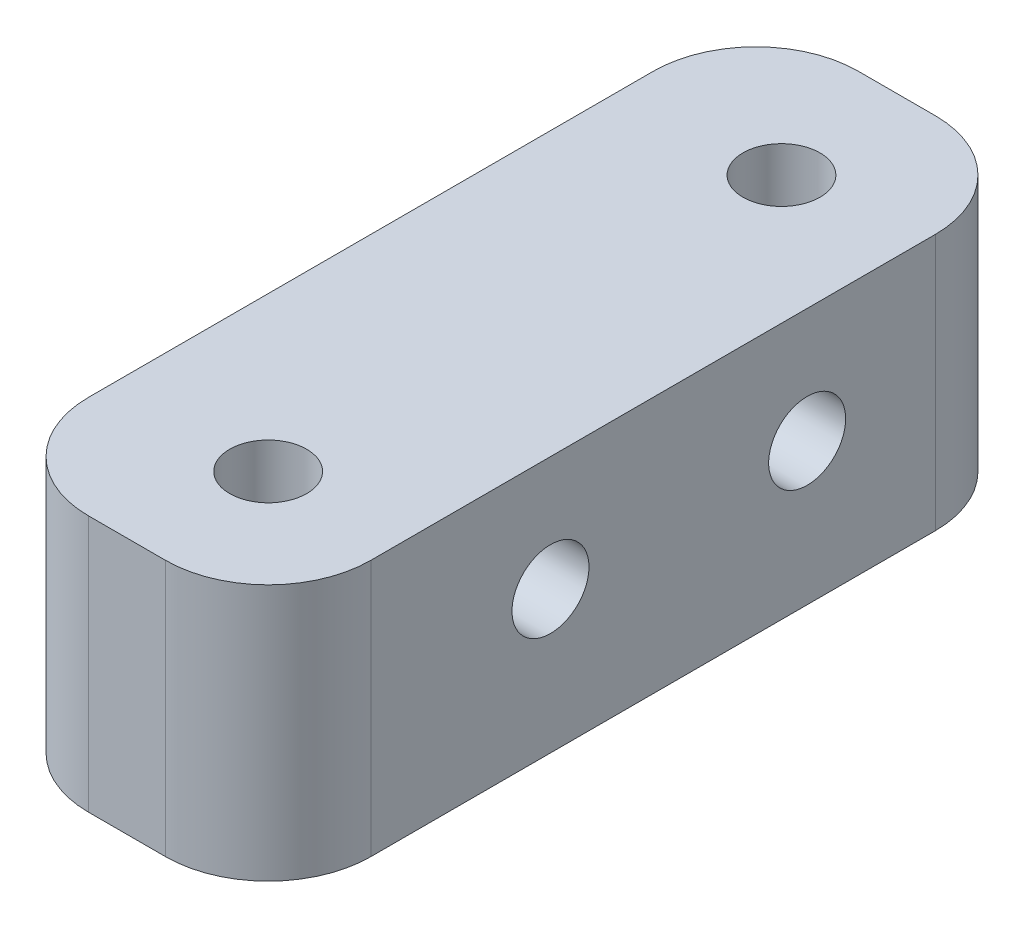
ISO-10303-21;
HEADER;
FILE_DESCRIPTION(('STEP AP214'),'2;1');
FILE_NAME('part.step','',(''),(''),'','','');
FILE_SCHEMA(('AUTOMOTIVE_DESIGN { 1 0 10303 214 1 1 1 1 }'));
ENDSEC;
DATA;
#1=APPLICATION_CONTEXT('core data for automotive mechanical design processes');
#2=APPLICATION_PROTOCOL_DEFINITION('international standard','automotive_design',2000,#1);
#3=PRODUCT_CONTEXT('',#1,'mechanical');
#4=PRODUCT('Part','Part','',(#3));
#5=PRODUCT_RELATED_PRODUCT_CATEGORY('part','',(#4));
#6=PRODUCT_DEFINITION_FORMATION('','',#4);
#7=PRODUCT_DEFINITION_CONTEXT('part definition',#1,'design');
#8=PRODUCT_DEFINITION('design','',#6,#7);
#9=PRODUCT_DEFINITION_SHAPE('','',#8);
#10=(LENGTH_UNIT() NAMED_UNIT(*) SI_UNIT(.MILLI.,.METRE.));
#11=(NAMED_UNIT(*) PLANE_ANGLE_UNIT() SI_UNIT($,.RADIAN.));
#12=(NAMED_UNIT(*) SI_UNIT($,.STERADIAN.) SOLID_ANGLE_UNIT());
#13=UNCERTAINTY_MEASURE_WITH_UNIT(LENGTH_MEASURE(1.E-05),#10,'distance_accuracy_value','');
#14=(GEOMETRIC_REPRESENTATION_CONTEXT(3) GLOBAL_UNCERTAINTY_ASSIGNED_CONTEXT((#13)) GLOBAL_UNIT_ASSIGNED_CONTEXT((#10,
#11,#12)) REPRESENTATION_CONTEXT('',''));
#15=CARTESIAN_POINT('',(0.,0.,0.));
#16=DIRECTION('',(0.,0.,1.));
#17=DIRECTION('',(1.,0.,0.));
#18=AXIS2_PLACEMENT_3D('',#15,#16,#17);
#19=CARTESIAN_POINT('',(0.,10.,0.));
#20=DIRECTION('',(0.,-1.,0.));
#21=DIRECTION('',(0.,0.,-1.));
#22=AXIS2_PLACEMENT_3D('',#19,#20,#21);
#23=PLANE('',#22);
#24=DIRECTION('',(-1.,0.,0.));
#25=VECTOR('',#24,1.);
#26=CARTESIAN_POINT('',(0.,10.,-30.));
#27=LINE('',#26,#25);
#28=CARTESIAN_POINT('',(7.,10.,-30.));
#29=VERTEX_POINT('',#28);
#30=CARTESIAN_POINT('',(4.,10.,-30.));
#31=VERTEX_POINT('',#30);
#32=EDGE_CURVE('E150',#29,#31,#27,.T.);
#33=ORIENTED_EDGE('',*,*,#32,.T.);
#34=CARTESIAN_POINT('',(4.,10.,-26.));
#35=DIRECTION('',(0.,-1.,0.));
#36=DIRECTION('',(0.,0.,-1.));
#37=AXIS2_PLACEMENT_3D('',#34,#35,#36);
#38=CIRCLE('',#37,4.);
#39=CARTESIAN_POINT('',(0.,10.,-26.));
#40=VERTEX_POINT('',#39);
#41=EDGE_CURVE('E168',#31,#40,#38,.F.);
#42=ORIENTED_EDGE('',*,*,#41,.T.);
#43=DIRECTION('',(0.,0.,1.));
#44=VECTOR('',#43,1.);
#45=CARTESIAN_POINT('',(0.,10.,0.));
#46=LINE('',#45,#44);
#47=CARTESIAN_POINT('',(0.,10.,-4.));
#48=VERTEX_POINT('',#47);
#49=EDGE_CURVE('E132',#40,#48,#46,.T.);
#50=ORIENTED_EDGE('',*,*,#49,.T.);
#51=CARTESIAN_POINT('',(4.,10.,-4.));
#52=DIRECTION('',(0.,-1.,0.));
#53=DIRECTION('',(0.,0.,-1.));
#54=AXIS2_PLACEMENT_3D('',#51,#52,#53);
#55=CIRCLE('',#54,4.);
#56=CARTESIAN_POINT('',(4.,10.,0.));
#57=VERTEX_POINT('',#56);
#58=EDGE_CURVE('E164',#48,#57,#55,.F.);
#59=ORIENTED_EDGE('',*,*,#58,.T.);
#60=DIRECTION('',(1.,0.,0.));
#61=VECTOR('',#60,1.);
#62=CARTESIAN_POINT('',(0.,10.,0.));
#63=LINE('',#62,#61);
#64=CARTESIAN_POINT('',(7.,10.,0.));
#65=VERTEX_POINT('',#64);
#66=EDGE_CURVE('E177',#57,#65,#63,.T.);
#67=ORIENTED_EDGE('',*,*,#66,.T.);
#68=CARTESIAN_POINT('',(7.,10.,-4.));
#69=DIRECTION('',(0.,-1.,0.));
#70=DIRECTION('',(0.,0.,-1.));
#71=AXIS2_PLACEMENT_3D('',#68,#69,#70);
#72=CIRCLE('',#71,4.);
#73=CARTESIAN_POINT('',(11.,10.,-4.));
#74=VERTEX_POINT('',#73);
#75=EDGE_CURVE('E67',#65,#74,#72,.F.);
#76=ORIENTED_EDGE('',*,*,#75,.T.);
#77=DIRECTION('',(0.,0.,-1.));
#78=VECTOR('',#77,1.);
#79=CARTESIAN_POINT('',(11.,10.,0.));
#80=LINE('',#79,#78);
#81=CARTESIAN_POINT('',(11.,10.,-26.));
#82=VERTEX_POINT('',#81);
#83=EDGE_CURVE('E183',#74,#82,#80,.T.);
#84=ORIENTED_EDGE('',*,*,#83,.T.);
#85=CARTESIAN_POINT('',(7.,10.,-26.));
#86=DIRECTION('',(0.,-1.,0.));
#87=DIRECTION('',(0.,0.,-1.));
#88=AXIS2_PLACEMENT_3D('',#85,#86,#87);
#89=CIRCLE('',#88,4.);
#90=EDGE_CURVE('E166',#82,#29,#89,.F.);
#91=ORIENTED_EDGE('',*,*,#90,.T.);
#92=EDGE_LOOP('',(#33,#42,#50,#59,#67,#76,#84,#91));
#93=FACE_BOUND('',#92,.T.);
#94=CARTESIAN_POINT('',(5.99999999999999,10.,-25.));
#95=DIRECTION('',(0.,1.,0.));
#96=DIRECTION('',(0.,0.,1.));
#97=AXIS2_PLACEMENT_3D('',#94,#95,#96);
#98=CIRCLE('',#97,1.5);
#99=CARTESIAN_POINT('',(5.99999999999999,10.,-23.5));
#100=VERTEX_POINT('',#99);
#101=EDGE_CURVE('E141',#100,#100,#98,.T.);
#102=ORIENTED_EDGE('',*,*,#101,.F.);
#103=EDGE_LOOP('',(#102));
#104=FACE_BOUND('',#103,.T.);
#105=CARTESIAN_POINT('',(6.,10.,-5.));
#106=DIRECTION('',(0.,1.,0.));
#107=DIRECTION('',(0.,0.,1.));
#108=AXIS2_PLACEMENT_3D('',#105,#106,#107);
#109=CIRCLE('',#108,1.5);
#110=CARTESIAN_POINT('',(6.,10.,-3.5));
#111=VERTEX_POINT('',#110);
#112=EDGE_CURVE('E198',#111,#111,#109,.T.);
#113=ORIENTED_EDGE('',*,*,#112,.F.);
#114=EDGE_LOOP('',(#113));
#115=FACE_BOUND('',#114,.T.);
#116=ADVANCED_FACE('F45',(#93,#104,#115),#23,.F.);
#117=CARTESIAN_POINT('',(0.,0.,0.));
#118=DIRECTION('',(0.,-1.,0.));
#119=DIRECTION('',(0.,0.,-1.));
#120=AXIS2_PLACEMENT_3D('',#117,#118,#119);
#121=PLANE('',#120);
#122=CARTESIAN_POINT('',(5.99999999999999,0.,-25.));
#123=DIRECTION('',(0.,1.,0.));
#124=DIRECTION('',(0.,0.,1.));
#125=AXIS2_PLACEMENT_3D('',#122,#123,#124);
#126=CIRCLE('',#125,1.5);
#127=CARTESIAN_POINT('',(5.99999999999999,0.,-23.5));
#128=VERTEX_POINT('',#127);
#129=EDGE_CURVE('E147',#128,#128,#126,.T.);
#130=ORIENTED_EDGE('',*,*,#129,.T.);
#131=EDGE_LOOP('',(#130));
#132=FACE_BOUND('',#131,.T.);
#133=DIRECTION('',(0.,0.,1.));
#134=VECTOR('',#133,1.);
#135=CARTESIAN_POINT('',(0.,0.,0.));
#136=LINE('',#135,#134);
#137=CARTESIAN_POINT('',(0.,0.,-26.));
#138=VERTEX_POINT('',#137);
#139=CARTESIAN_POINT('',(0.,0.,-4.));
#140=VERTEX_POINT('',#139);
#141=EDGE_CURVE('E129',#138,#140,#136,.T.);
#142=ORIENTED_EDGE('',*,*,#141,.F.);
#143=CARTESIAN_POINT('',(4.,0.,-26.));
#144=DIRECTION('',(0.,-1.,0.));
#145=DIRECTION('',(0.,0.,-1.));
#146=AXIS2_PLACEMENT_3D('',#143,#144,#145);
#147=CIRCLE('',#146,4.);
#148=CARTESIAN_POINT('',(4.,0.,-30.));
#149=VERTEX_POINT('',#148);
#150=EDGE_CURVE('E112',#138,#149,#147,.T.);
#151=ORIENTED_EDGE('',*,*,#150,.T.);
#152=DIRECTION('',(-1.,0.,0.));
#153=VECTOR('',#152,1.);
#154=CARTESIAN_POINT('',(0.,0.,-30.));
#155=LINE('',#154,#153);
#156=CARTESIAN_POINT('',(7.,0.,-30.));
#157=VERTEX_POINT('',#156);
#158=EDGE_CURVE('E154',#157,#149,#155,.T.);
#159=ORIENTED_EDGE('',*,*,#158,.F.);
#160=CARTESIAN_POINT('',(7.,0.,-26.));
#161=DIRECTION('',(0.,-1.,0.));
#162=DIRECTION('',(0.,0.,-1.));
#163=AXIS2_PLACEMENT_3D('',#160,#161,#162);
#164=CIRCLE('',#163,4.);
#165=CARTESIAN_POINT('',(11.,0.,-26.));
#166=VERTEX_POINT('',#165);
#167=EDGE_CURVE('E123',#157,#166,#164,.T.);
#168=ORIENTED_EDGE('',*,*,#167,.T.);
#169=DIRECTION('',(0.,0.,-1.));
#170=VECTOR('',#169,1.);
#171=CARTESIAN_POINT('',(11.,0.,0.));
#172=LINE('',#171,#170);
#173=CARTESIAN_POINT('',(11.,0.,-4.));
#174=VERTEX_POINT('',#173);
#175=EDGE_CURVE('E144',#174,#166,#172,.T.);
#176=ORIENTED_EDGE('',*,*,#175,.F.);
#177=CARTESIAN_POINT('',(7.,0.,-4.));
#178=DIRECTION('',(0.,-1.,0.));
#179=DIRECTION('',(0.,0.,-1.));
#180=AXIS2_PLACEMENT_3D('',#177,#178,#179);
#181=CIRCLE('',#180,4.);
#182=CARTESIAN_POINT('',(7.,0.,0.));
#183=VERTEX_POINT('',#182);
#184=EDGE_CURVE('E133',#174,#183,#181,.T.);
#185=ORIENTED_EDGE('',*,*,#184,.T.);
#186=DIRECTION('',(1.,0.,0.));
#187=VECTOR('',#186,1.);
#188=CARTESIAN_POINT('',(0.,0.,0.));
#189=LINE('',#188,#187);
#190=CARTESIAN_POINT('',(4.,0.,0.));
#191=VERTEX_POINT('',#190);
#192=EDGE_CURVE('E140',#191,#183,#189,.T.);
#193=ORIENTED_EDGE('',*,*,#192,.F.);
#194=CARTESIAN_POINT('',(4.,0.,-4.));
#195=DIRECTION('',(0.,-1.,0.));
#196=DIRECTION('',(0.,0.,-1.));
#197=AXIS2_PLACEMENT_3D('',#194,#195,#196);
#198=CIRCLE('',#197,4.);
#199=EDGE_CURVE('E139',#191,#140,#198,.T.);
#200=ORIENTED_EDGE('',*,*,#199,.T.);
#201=EDGE_LOOP('',(#142,#151,#159,#168,#176,#185,#193,#200));
#202=FACE_BOUND('',#201,.T.);
#203=CARTESIAN_POINT('',(6.,0.,-5.));
#204=DIRECTION('',(0.,1.,0.));
#205=DIRECTION('',(0.,0.,1.));
#206=AXIS2_PLACEMENT_3D('',#203,#204,#205);
#207=CIRCLE('',#206,1.5);
#208=CARTESIAN_POINT('',(6.,0.,-3.5));
#209=VERTEX_POINT('',#208);
#210=EDGE_CURVE('E200',#209,#209,#207,.T.);
#211=ORIENTED_EDGE('',*,*,#210,.T.);
#212=EDGE_LOOP('',(#211));
#213=FACE_BOUND('',#212,.T.);
#214=ADVANCED_FACE('F136',(#132,#202,#213),#121,.T.);
#215=CARTESIAN_POINT('',(0.,10.,0.));
#216=DIRECTION('',(1.,0.,0.));
#217=DIRECTION('',(0.,0.,-1.));
#218=AXIS2_PLACEMENT_3D('',#215,#216,#217);
#219=PLANE('',#218);
#220=CARTESIAN_POINT('',(0.,5.53045340056551,-11.));
#221=DIRECTION('',(1.,0.,0.));
#222=DIRECTION('',(0.,0.,-1.));
#223=AXIS2_PLACEMENT_3D('',#220,#221,#222);
#224=CIRCLE('',#223,1.5);
#225=CARTESIAN_POINT('',(0.,5.53045340056551,-12.5));
#226=VERTEX_POINT('',#225);
#227=EDGE_CURVE('E203',#226,#226,#224,.T.);
#228=ORIENTED_EDGE('',*,*,#227,.T.);
#229=EDGE_LOOP('',(#228));
#230=FACE_BOUND('',#229,.T.);
#231=CARTESIAN_POINT('',(0.,5.53045340056551,-21.));
#232=DIRECTION('',(1.,0.,0.));
#233=DIRECTION('',(0.,0.,-1.));
#234=AXIS2_PLACEMENT_3D('',#231,#232,#233);
#235=CIRCLE('',#234,1.5);
#236=CARTESIAN_POINT('',(0.,5.53045340056551,-22.5));
#237=VERTEX_POINT('',#236);
#238=EDGE_CURVE('E206',#237,#237,#235,.T.);
#239=ORIENTED_EDGE('',*,*,#238,.T.);
#240=EDGE_LOOP('',(#239));
#241=FACE_BOUND('',#240,.T.);
#242=ORIENTED_EDGE('',*,*,#49,.F.);
#243=DIRECTION('',(0.,-1.,0.));
#244=VECTOR('',#243,1.);
#245=CARTESIAN_POINT('',(0.,10.,-26.));
#246=LINE('',#245,#244);
#247=EDGE_CURVE('E116',#40,#138,#246,.T.);
#248=ORIENTED_EDGE('',*,*,#247,.T.);
#249=ORIENTED_EDGE('',*,*,#141,.T.);
#250=DIRECTION('',(0.,-1.,0.));
#251=VECTOR('',#250,1.);
#252=CARTESIAN_POINT('',(0.,10.,-4.));
#253=LINE('',#252,#251);
#254=EDGE_CURVE('E134',#140,#48,#253,.F.);
#255=ORIENTED_EDGE('',*,*,#254,.T.);
#256=EDGE_LOOP('',(#242,#248,#249,#255));
#257=FACE_BOUND('',#256,.T.);
#258=ADVANCED_FACE('F128',(#230,#241,#257),#219,.F.);
#259=CARTESIAN_POINT('',(0.,10.,0.));
#260=DIRECTION('',(0.,0.,-1.));
#261=DIRECTION('',(-1.,0.,0.));
#262=AXIS2_PLACEMENT_3D('',#259,#260,#261);
#263=PLANE('',#262);
#264=ORIENTED_EDGE('',*,*,#66,.F.);
#265=DIRECTION('',(0.,-1.,0.));
#266=VECTOR('',#265,1.);
#267=CARTESIAN_POINT('',(4.,10.,0.));
#268=LINE('',#267,#266);
#269=EDGE_CURVE('E11',#57,#191,#268,.T.);
#270=ORIENTED_EDGE('',*,*,#269,.T.);
#271=ORIENTED_EDGE('',*,*,#192,.T.);
#272=DIRECTION('',(0.,-1.,0.));
#273=VECTOR('',#272,1.);
#274=CARTESIAN_POINT('',(7.,10.,0.));
#275=LINE('',#274,#273);
#276=EDGE_CURVE('E53',#183,#65,#275,.F.);
#277=ORIENTED_EDGE('',*,*,#276,.T.);
#278=EDGE_LOOP('',(#264,#270,#271,#277));
#279=FACE_BOUND('',#278,.T.);
#280=ADVANCED_FACE('F176',(#279),#263,.F.);
#281=CARTESIAN_POINT('',(11.,10.,0.));
#282=DIRECTION('',(-1.,0.,0.));
#283=DIRECTION('',(0.,0.,1.));
#284=AXIS2_PLACEMENT_3D('',#281,#282,#283);
#285=PLANE('',#284);
#286=CARTESIAN_POINT('',(11.,5.53045340056551,-11.));
#287=DIRECTION('',(1.,0.,0.));
#288=DIRECTION('',(0.,0.,-1.));
#289=AXIS2_PLACEMENT_3D('',#286,#287,#288);
#290=CIRCLE('',#289,1.5);
#291=CARTESIAN_POINT('',(11.,5.53045340056551,-12.5));
#292=VERTEX_POINT('',#291);
#293=EDGE_CURVE('E212',#292,#292,#290,.T.);
#294=ORIENTED_EDGE('',*,*,#293,.F.);
#295=EDGE_LOOP('',(#294));
#296=FACE_BOUND('',#295,.T.);
#297=CARTESIAN_POINT('',(11.,5.53045340056551,-21.));
#298=DIRECTION('',(1.,0.,0.));
#299=DIRECTION('',(0.,0.,-1.));
#300=AXIS2_PLACEMENT_3D('',#297,#298,#299);
#301=CIRCLE('',#300,1.5);
#302=CARTESIAN_POINT('',(11.,5.53045340056551,-22.5));
#303=VERTEX_POINT('',#302);
#304=EDGE_CURVE('E209',#303,#303,#301,.T.);
#305=ORIENTED_EDGE('',*,*,#304,.F.);
#306=EDGE_LOOP('',(#305));
#307=FACE_BOUND('',#306,.T.);
#308=ORIENTED_EDGE('',*,*,#175,.T.);
#309=DIRECTION('',(0.,-1.,0.));
#310=VECTOR('',#309,1.);
#311=CARTESIAN_POINT('',(11.,10.,-26.));
#312=LINE('',#311,#310);
#313=EDGE_CURVE('E60',#166,#82,#312,.F.);
#314=ORIENTED_EDGE('',*,*,#313,.T.);
#315=ORIENTED_EDGE('',*,*,#83,.F.);
#316=DIRECTION('',(0.,-1.,0.));
#317=VECTOR('',#316,1.);
#318=CARTESIAN_POINT('',(11.,10.,-4.));
#319=LINE('',#318,#317);
#320=EDGE_CURVE('E170',#74,#174,#319,.T.);
#321=ORIENTED_EDGE('',*,*,#320,.T.);
#322=EDGE_LOOP('',(#308,#314,#315,#321));
#323=FACE_BOUND('',#322,.T.);
#324=ADVANCED_FACE('F187',(#296,#307,#323),#285,.F.);
#325=CARTESIAN_POINT('',(0.,10.,-30.));
#326=DIRECTION('',(0.,0.,1.));
#327=DIRECTION('',(1.,0.,0.));
#328=AXIS2_PLACEMENT_3D('',#325,#326,#327);
#329=PLANE('',#328);
#330=ORIENTED_EDGE('',*,*,#158,.T.);
#331=DIRECTION('',(0.,-1.,0.));
#332=VECTOR('',#331,1.);
#333=CARTESIAN_POINT('',(4.,10.,-30.));
#334=LINE('',#333,#332);
#335=EDGE_CURVE('E117',#149,#31,#334,.F.);
#336=ORIENTED_EDGE('',*,*,#335,.T.);
#337=ORIENTED_EDGE('',*,*,#32,.F.);
#338=DIRECTION('',(0.,-1.,0.));
#339=VECTOR('',#338,1.);
#340=CARTESIAN_POINT('',(7.,10.,-30.));
#341=LINE('',#340,#339);
#342=EDGE_CURVE('E122',#29,#157,#341,.T.);
#343=ORIENTED_EDGE('',*,*,#342,.T.);
#344=EDGE_LOOP('',(#330,#336,#337,#343));
#345=FACE_BOUND('',#344,.T.);
#346=ADVANCED_FACE('F194',(#345),#329,.F.);
#347=CARTESIAN_POINT('',(5.99999999999999,10.,-25.));
#348=DIRECTION('',(0.,-1.,0.));
#349=DIRECTION('',(0.,0.,-1.));
#350=AXIS2_PLACEMENT_3D('',#347,#348,#349);
#351=CYLINDRICAL_SURFACE('',#350,1.5);
#352=ORIENTED_EDGE('',*,*,#101,.T.);
#353=EDGE_LOOP('',(#352));
#354=FACE_BOUND('',#353,.T.);
#355=ORIENTED_EDGE('',*,*,#129,.F.);
#356=EDGE_LOOP('',(#355));
#357=FACE_BOUND('',#356,.T.);
#358=ADVANCED_FACE('F239',(#354,#357),#351,.F.);
#359=CARTESIAN_POINT('',(6.,10.,-5.));
#360=DIRECTION('',(0.,-1.,0.));
#361=DIRECTION('',(0.,0.,-1.));
#362=AXIS2_PLACEMENT_3D('',#359,#360,#361);
#363=CYLINDRICAL_SURFACE('',#362,1.5);
#364=ORIENTED_EDGE('',*,*,#112,.T.);
#365=EDGE_LOOP('',(#364));
#366=FACE_BOUND('',#365,.T.);
#367=ORIENTED_EDGE('',*,*,#210,.F.);
#368=EDGE_LOOP('',(#367));
#369=FACE_BOUND('',#368,.T.);
#370=ADVANCED_FACE('F233',(#366,#369),#363,.F.);
#371=CARTESIAN_POINT('',(0.,5.53045340056551,-21.));
#372=DIRECTION('',(1.,0.,0.));
#373=DIRECTION('',(0.,0.,-1.));
#374=AXIS2_PLACEMENT_3D('',#371,#372,#373);
#375=CYLINDRICAL_SURFACE('',#374,1.5);
#376=ORIENTED_EDGE('',*,*,#238,.F.);
#377=EDGE_LOOP('',(#376));
#378=FACE_BOUND('',#377,.T.);
#379=ORIENTED_EDGE('',*,*,#304,.T.);
#380=EDGE_LOOP('',(#379));
#381=FACE_BOUND('',#380,.T.);
#382=ADVANCED_FACE('F223',(#378,#381),#375,.F.);
#383=CARTESIAN_POINT('',(0.,5.53045340056551,-11.));
#384=DIRECTION('',(1.,0.,0.));
#385=DIRECTION('',(0.,0.,-1.));
#386=AXIS2_PLACEMENT_3D('',#383,#384,#385);
#387=CYLINDRICAL_SURFACE('',#386,1.5);
#388=ORIENTED_EDGE('',*,*,#227,.F.);
#389=EDGE_LOOP('',(#388));
#390=FACE_BOUND('',#389,.T.);
#391=ORIENTED_EDGE('',*,*,#293,.T.);
#392=EDGE_LOOP('',(#391));
#393=FACE_BOUND('',#392,.T.);
#394=ADVANCED_FACE('F220',(#390,#393),#387,.F.);
#395=CARTESIAN_POINT('',(4.,10.,-26.));
#396=DIRECTION('',(0.,-1.,0.));
#397=DIRECTION('',(0.,0.,-1.));
#398=AXIS2_PLACEMENT_3D('',#395,#396,#397);
#399=CYLINDRICAL_SURFACE('',#398,4.);
#400=ORIENTED_EDGE('',*,*,#41,.F.);
#401=ORIENTED_EDGE('',*,*,#335,.F.);
#402=ORIENTED_EDGE('',*,*,#150,.F.);
#403=ORIENTED_EDGE('',*,*,#247,.F.);
#404=EDGE_LOOP('',(#400,#401,#402,#403));
#405=FACE_BOUND('',#404,.T.);
#406=ADVANCED_FACE('F115',(#405),#399,.T.);
#407=CARTESIAN_POINT('',(7.,10.,-26.));
#408=DIRECTION('',(0.,-1.,0.));
#409=DIRECTION('',(0.,0.,-1.));
#410=AXIS2_PLACEMENT_3D('',#407,#408,#409);
#411=CYLINDRICAL_SURFACE('',#410,4.);
#412=ORIENTED_EDGE('',*,*,#90,.F.);
#413=ORIENTED_EDGE('',*,*,#313,.F.);
#414=ORIENTED_EDGE('',*,*,#167,.F.);
#415=ORIENTED_EDGE('',*,*,#342,.F.);
#416=EDGE_LOOP('',(#412,#413,#414,#415));
#417=FACE_BOUND('',#416,.T.);
#418=ADVANCED_FACE('F191',(#417),#411,.T.);
#419=CARTESIAN_POINT('',(4.,10.,-4.));
#420=DIRECTION('',(0.,-1.,0.));
#421=DIRECTION('',(0.,0.,-1.));
#422=AXIS2_PLACEMENT_3D('',#419,#420,#421);
#423=CYLINDRICAL_SURFACE('',#422,4.);
#424=ORIENTED_EDGE('',*,*,#58,.F.);
#425=ORIENTED_EDGE('',*,*,#254,.F.);
#426=ORIENTED_EDGE('',*,*,#199,.F.);
#427=ORIENTED_EDGE('',*,*,#269,.F.);
#428=EDGE_LOOP('',(#424,#425,#426,#427));
#429=FACE_BOUND('',#428,.T.);
#430=ADVANCED_FACE('F261',(#429),#423,.T.);
#431=CARTESIAN_POINT('',(7.,10.,-4.));
#432=DIRECTION('',(0.,-1.,0.));
#433=DIRECTION('',(0.,0.,-1.));
#434=AXIS2_PLACEMENT_3D('',#431,#432,#433);
#435=CYLINDRICAL_SURFACE('',#434,4.);
#436=ORIENTED_EDGE('',*,*,#75,.F.);
#437=ORIENTED_EDGE('',*,*,#276,.F.);
#438=ORIENTED_EDGE('',*,*,#184,.F.);
#439=ORIENTED_EDGE('',*,*,#320,.F.);
#440=EDGE_LOOP('',(#436,#437,#438,#439));
#441=FACE_BOUND('',#440,.T.);
#442=ADVANCED_FACE('F47',(#441),#435,.T.);
#443=CLOSED_SHELL('',(#116,#214,#258,#280,#324,#346,#358,#370,#382,#394,#406,#418,#430,#442));
#444=MANIFOLD_SOLID_BREP('B2',#443);
#445=ADVANCED_BREP_SHAPE_REPRESENTATION('',(#18,#444),#14);
#446=SHAPE_DEFINITION_REPRESENTATION(#9,#445);
ENDSEC;
END-ISO-10303-21;
